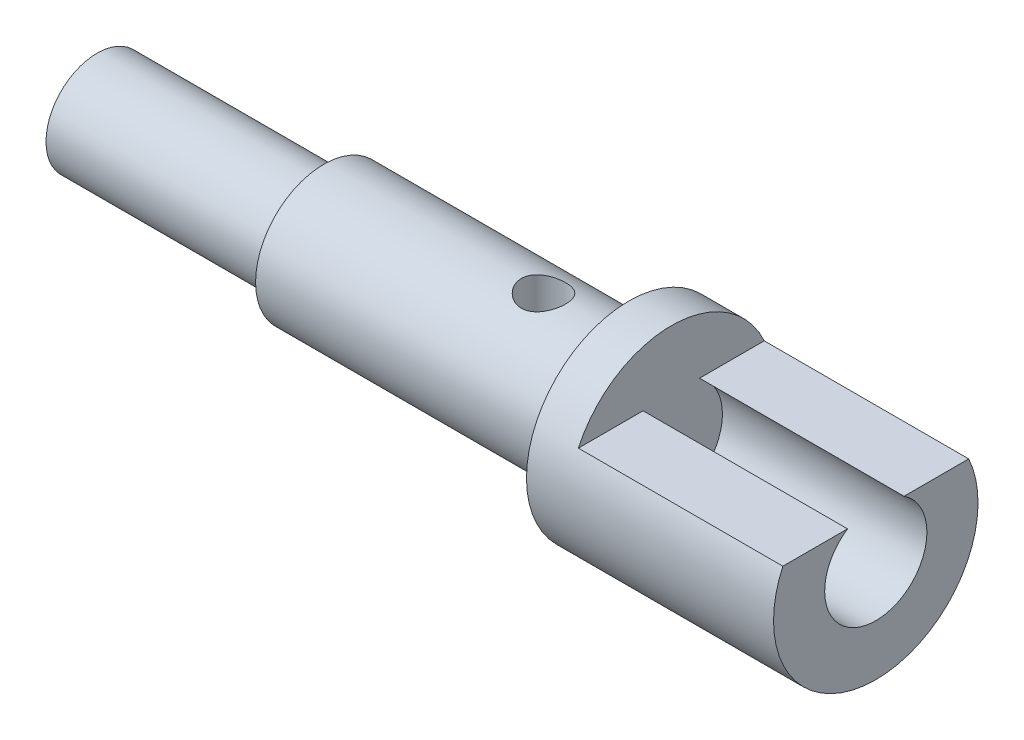
ISO-10303-21;
HEADER;
FILE_DESCRIPTION(('STEP AP214'),'2;1');
FILE_NAME('part.step','',(''),(''),'','','');
FILE_SCHEMA(('AUTOMOTIVE_DESIGN { 1 0 10303 214 1 1 1 1 }'));
ENDSEC;
DATA;
#1=APPLICATION_CONTEXT('core data for automotive mechanical design processes');
#2=APPLICATION_PROTOCOL_DEFINITION('international standard','automotive_design',2000,#1);
#3=PRODUCT_CONTEXT('',#1,'mechanical');
#4=PRODUCT('Part','Part','',(#3));
#5=PRODUCT_RELATED_PRODUCT_CATEGORY('part','',(#4));
#6=PRODUCT_DEFINITION_FORMATION('','',#4);
#7=PRODUCT_DEFINITION_CONTEXT('part definition',#1,'design');
#8=PRODUCT_DEFINITION('design','',#6,#7);
#9=PRODUCT_DEFINITION_SHAPE('','',#8);
#10=(LENGTH_UNIT() NAMED_UNIT(*) SI_UNIT(.MILLI.,.METRE.));
#11=(NAMED_UNIT(*) PLANE_ANGLE_UNIT() SI_UNIT($,.RADIAN.));
#12=(NAMED_UNIT(*) SI_UNIT($,.STERADIAN.) SOLID_ANGLE_UNIT());
#13=UNCERTAINTY_MEASURE_WITH_UNIT(LENGTH_MEASURE(1.E-05),#10,'distance_accuracy_value','');
#14=(GEOMETRIC_REPRESENTATION_CONTEXT(3) GLOBAL_UNCERTAINTY_ASSIGNED_CONTEXT((#13)) GLOBAL_UNIT_ASSIGNED_CONTEXT((#10,
#11,#12)) REPRESENTATION_CONTEXT('',''));
#15=CARTESIAN_POINT('',(0.,0.,0.));
#16=DIRECTION('',(0.,0.,1.));
#17=DIRECTION('',(1.,0.,0.));
#18=AXIS2_PLACEMENT_3D('',#15,#16,#17);
#19=CARTESIAN_POINT('',(31.2,0.,0.));
#20=DIRECTION('',(-1.,0.,0.));
#21=DIRECTION('',(0.,0.,1.));
#22=AXIS2_PLACEMENT_3D('',#19,#20,#21);
#23=CYLINDRICAL_SURFACE('',#22,4.);
#24=CARTESIAN_POINT('',(26.2,-3.78285606387555,1.3));
#25=CARTESIAN_POINT('',(26.1290801876133,-3.78285612771786,1.29999998637502));
#26=CARTESIAN_POINT('',(26.0581595683784,-3.78487224616612,1.29417693564307));
#27=CARTESIAN_POINT('',(25.918412307023,-3.79267955994554,1.27111225354953));
#28=CARTESIAN_POINT('',(25.8495861006694,-3.7984715353425,1.25386826268932));
#29=CARTESIAN_POINT('',(25.7160735528143,-3.81310673893288,1.20862563505493));
#30=CARTESIAN_POINT('',(25.6513796870643,-3.82194422252289,1.18064723492753));
#31=CARTESIAN_POINT('',(25.52758428474,-3.84166647872619,1.11479847755594));
#32=CARTESIAN_POINT('',(25.4684838881169,-3.85255166731782,1.07692610980589));
#33=CARTESIAN_POINT('',(25.3553559191439,-3.87559670629671,0.990856417647431));
#34=CARTESIAN_POINT('',(25.3015667315565,-3.88778716913958,0.942353886785881));
#35=CARTESIAN_POINT('',(25.2027244131502,-3.91180974753888,0.837052737978216));
#36=CARTESIAN_POINT('',(25.1576726085991,-3.92364180846299,0.780252862849214));
#37=CARTESIAN_POINT('',(25.0765143976226,-3.94596712912291,0.658238411185169));
#38=CARTESIAN_POINT('',(25.0406560247438,-3.95642017130275,0.592850847227957));
#39=CARTESIAN_POINT('',(24.9805404152484,-3.97445029673354,0.45657453117507));
#40=CARTESIAN_POINT('',(24.9562802157886,-3.98202811438068,0.385687189424112));
#41=CARTESIAN_POINT('',(24.9208529283771,-3.99323720505228,0.242921590185566));
#42=CARTESIAN_POINT('',(24.9092778474758,-3.99699116344267,0.171154386910905));
#43=CARTESIAN_POINT('',(24.8982539657494,-4.00056416931378,0.0266048150491737));
#44=CARTESIAN_POINT('',(24.8988021900175,-4.00038418213545,-0.0461773001104792));
#45=CARTESIAN_POINT('',(24.9117466571108,-3.99619364718308,-0.187809508580037));
#46=CARTESIAN_POINT('',(24.9237001100819,-3.99232626078031,-0.256704993176162));
#47=CARTESIAN_POINT('',(24.9583858033067,-3.9813737177908,-0.391452898560638));
#48=CARTESIAN_POINT('',(24.98111876401,-3.97428834613103,-0.457305115629002));
#49=CARTESIAN_POINT('',(25.0369871544799,-3.95750964480828,-0.585087039024713));
#50=CARTESIAN_POINT('',(25.0702519683615,-3.94778410475558,-0.646955772497173));
#51=CARTESIAN_POINT('',(25.1461343580486,-3.92674246369522,-0.764366772514483));
#52=CARTESIAN_POINT('',(25.1887544418315,-3.91542593646591,-0.819907336515701));
#53=CARTESIAN_POINT('',(25.2843861309341,-3.89180042429931,-0.925722197538991));
#54=CARTESIAN_POINT('',(25.3377783322912,-3.87946969202396,-0.97564816374936));
#55=CARTESIAN_POINT('',(25.452286836203,-3.8556379454429,-1.06594676141883));
#56=CARTESIAN_POINT('',(25.5134042082243,-3.84413704636561,-1.10631806791115));
#57=CARTESIAN_POINT('',(25.6426829890106,-3.82315182253367,-1.17681175206145));
#58=CARTESIAN_POINT('',(25.710925423276,-3.81369556435766,-1.20679452245038));
#59=CARTESIAN_POINT('',(25.8518738708974,-3.79819677806255,-1.25472837651415));
#60=CARTESIAN_POINT('',(25.9245781111602,-3.7921529034991,-1.27268420625183));
#61=CARTESIAN_POINT('',(26.0690270157782,-3.78446551581416,-1.29536048219797));
#62=CARTESIAN_POINT('',(26.1406778492493,-3.78264347747946,-1.3006183101324));
#63=CARTESIAN_POINT('',(26.2838465206955,-3.78310839816302,-1.29926602497262));
#64=CARTESIAN_POINT('',(26.3553643792448,-3.78539465735251,-1.29265793318104));
#65=CARTESIAN_POINT('',(26.4938463601344,-3.79364128301231,-1.26824322876077));
#66=CARTESIAN_POINT('',(26.560882964942,-3.7994813806764,-1.25080281914733));
#67=CARTESIAN_POINT('',(26.6910673762716,-3.81404732734364,-1.2056541043164));
#68=CARTESIAN_POINT('',(26.7542145131044,-3.82277367166269,-1.17794403659911));
#69=CARTESIAN_POINT('',(26.8769612662532,-3.84245888642472,-1.11208011614265));
#70=CARTESIAN_POINT('',(26.9363938782897,-3.85347774554132,-1.07363343158238));
#71=CARTESIAN_POINT('',(27.048158893736,-3.87638690296162,-0.98772352783187));
#72=CARTESIAN_POINT('',(27.1004892972951,-3.88827744526959,-0.940257778032011));
#73=CARTESIAN_POINT('',(27.1990163736486,-3.91224285586513,-0.835098032106396));
#74=CARTESIAN_POINT('',(27.2448270516538,-3.92430161202931,-0.777037691903762));
#75=CARTESIAN_POINT('',(27.3260762250894,-3.94670982473907,-0.653758926475176));
#76=CARTESIAN_POINT('',(27.3615151381005,-3.95705935009319,-0.588540789576765));
#77=CARTESIAN_POINT('',(27.4206824206189,-3.97482978260151,-0.453157385214432));
#78=CARTESIAN_POINT('',(27.4444910884153,-3.98227069809607,-0.383029975227223));
#79=CARTESIAN_POINT('',(27.4798865698338,-3.9934726882738,-0.239479013843675));
#80=CARTESIAN_POINT('',(27.491477554083,-3.99723501864663,-0.166056596159588));
#81=CARTESIAN_POINT('',(27.501747970419,-4.00056582978003,-0.0215393353329791));
#82=CARTESIAN_POINT('',(27.5009828635471,-4.00031473710671,0.0495123185890754));
#83=CARTESIAN_POINT('',(27.4879220482261,-3.99608624347839,0.190428002988575));
#84=CARTESIAN_POINT('',(27.4756271985669,-3.99210912005583,0.26029212152468));
#85=CARTESIAN_POINT('',(27.4402187126954,-3.98093800748819,0.395848355030433));
#86=CARTESIAN_POINT('',(27.4172641574112,-3.97379138683307,0.461586202747414));
#87=CARTESIAN_POINT('',(27.3613335517974,-3.95701734013223,0.588305667201566));
#88=CARTESIAN_POINT('',(27.3283557221735,-3.9473894736712,0.649286437062812));
#89=CARTESIAN_POINT('',(27.2519542189635,-3.92622151264744,0.767136756616273));
#90=CARTESIAN_POINT('',(27.2081991169553,-3.91462534018168,0.823781249191498));
#91=CARTESIAN_POINT('',(27.1120572379489,-3.89097421850494,0.929106520446989));
#92=CARTESIAN_POINT('',(27.0596677765308,-3.87891912751551,0.977784813028035));
#93=CARTESIAN_POINT('',(26.9454448756089,-3.85518605580607,1.06760515091112));
#94=CARTESIAN_POINT('',(26.8833355709839,-3.84353811451073,1.10840538095549));
#95=CARTESIAN_POINT('',(26.7527836227471,-3.82249023530611,1.17895321389889));
#96=CARTESIAN_POINT('',(26.6843430223426,-3.81308957565012,1.20870436707114));
#97=CARTESIAN_POINT('',(26.5473831663509,-3.79820133944386,1.25467797781187));
#98=CARTESIAN_POINT('',(26.4791280362841,-3.79250852489503,1.27162042160498));
#99=CARTESIAN_POINT('',(26.3405817876102,-3.78483641596639,1.29427974512782));
#100=CARTESIAN_POINT('',(26.2702912901102,-3.78285600059904,1.30000001350422));
#101=CARTESIAN_POINT('',(26.2,-3.78285606387555,1.3));
#102=B_SPLINE_CURVE_WITH_KNOTS('',3,(#24,#25,#26,#27,#28,#29,#30,#31,#32,#33,#34,#35,#36,#37,
#38,#39,#40,#41,#42,#43,#44,#45,#46,#47,#48,#49,#50,#51,#52,#53,#54,#55,#56,#57,#58,#59,#60,#61,
#62,#63,#64,#65,#66,#67,#68,#69,#70,#71,#72,#73,#74,#75,#76,#77,#78,#79,#80,#81,#82,#83,#84,#85,
#86,#87,#88,#89,#90,#91,#92,#93,#94,#95,#96,#97,#98,#99,#100,#101),.UNSPECIFIED.,.T.,.F.,(4,2,2,
2,2,2,2,2,2,2,2,2,2,2,2,2,2,2,2,2,2,2,2,2,2,2,2,2,2,2,2,2,2,2,2,2,2,2,4),(0.,0.212499402014874,
0.425042718847951,0.637187299645767,0.849375022906671,1.06872075418688,1.28809975445794,
1.51288949193992,1.73762177441719,1.95489211897283,2.17210914870698,2.38122222883872,
2.59034928703453,2.80215225758898,3.01401207815805,3.235382443622,3.4567834890635,
3.68105389836766,3.90523575401773,4.11974977776661,4.33422726354507,4.54182147149083,
4.74945132369134,4.96341563382456,5.17744006790926,5.4011745661775,5.62490005536644,
5.84705824934249,6.0691405828361,6.28126825800324,6.49338013415177,6.70242353387924,
6.91150406390515,7.12806277059302,7.34468893277309,7.56925885258851,7.79375655136618,
8.00443631772979,8.21505245745966),.UNSPECIFIED.);
#103=CARTESIAN_POINT('',(26.2,-3.78285606387555,1.3));
#104=VERTEX_POINT('',#103);
#105=EDGE_CURVE('E39',#104,#104,#102,.T.);
#106=ORIENTED_EDGE('',*,*,#105,.F.);
#107=EDGE_LOOP('',(#106));
#108=FACE_BOUND('',#107,.T.);
#109=CARTESIAN_POINT('',(26.2,3.78285606387555,1.3));
#110=CARTESIAN_POINT('',(26.2709198123868,3.78285612771786,1.29999998637502));
#111=CARTESIAN_POINT('',(26.3418404316216,3.78487224616612,1.29417693564307));
#112=CARTESIAN_POINT('',(26.481587692977,3.79267955994554,1.27111225354953));
#113=CARTESIAN_POINT('',(26.5504138993306,3.7984715353425,1.25386826268932));
#114=CARTESIAN_POINT('',(26.6839264471858,3.81310673893288,1.20862563505493));
#115=CARTESIAN_POINT('',(26.7486203129357,3.82194422252289,1.18064723492753));
#116=CARTESIAN_POINT('',(26.87241571526,3.84166647872619,1.11479847755594));
#117=CARTESIAN_POINT('',(26.9315161118831,3.85255166731782,1.0769261098059));
#118=CARTESIAN_POINT('',(27.0446440808561,3.87559670629671,0.990856417647434));
#119=CARTESIAN_POINT('',(27.0984332684435,3.88778716913958,0.942353886785882));
#120=CARTESIAN_POINT('',(27.1972755868499,3.91180974753888,0.837052737978217));
#121=CARTESIAN_POINT('',(27.2423273914009,3.92364180846299,0.780252862849215));
#122=CARTESIAN_POINT('',(27.3234856023774,3.94596712912291,0.65823841118517));
#123=CARTESIAN_POINT('',(27.3593439752562,3.95642017130275,0.592850847227957));
#124=CARTESIAN_POINT('',(27.4194595847516,3.97445029673354,0.45657453117507));
#125=CARTESIAN_POINT('',(27.4437197842114,3.98202811438068,0.385687189424112));
#126=CARTESIAN_POINT('',(27.4791470716229,3.99323720505228,0.242921590185566));
#127=CARTESIAN_POINT('',(27.4907221525242,3.99699116344267,0.171154386910905));
#128=CARTESIAN_POINT('',(27.5017460342507,4.00056416931378,0.0266048150491737));
#129=CARTESIAN_POINT('',(27.5011978099825,4.00038418213545,-0.0461773001104791));
#130=CARTESIAN_POINT('',(27.4882533428892,3.99619364718308,-0.187809508580038));
#131=CARTESIAN_POINT('',(27.4762998899181,3.99232626078031,-0.256704993176163));
#132=CARTESIAN_POINT('',(27.4416141966933,3.9813737177908,-0.391452898560639));
#133=CARTESIAN_POINT('',(27.41888123599,3.97428834613103,-0.457305115629003));
#134=CARTESIAN_POINT('',(27.3630128455201,3.95750964480828,-0.585087039024714));
#135=CARTESIAN_POINT('',(27.3297480316385,3.94778410475558,-0.646955772497174));
#136=CARTESIAN_POINT('',(27.2538656419514,3.92674246369522,-0.764366772514484));
#137=CARTESIAN_POINT('',(27.2112455581685,3.91542593646591,-0.819907336515702));
#138=CARTESIAN_POINT('',(27.1156138690659,3.89180042429931,-0.925722197538991));
#139=CARTESIAN_POINT('',(27.0622216677088,3.87946969202396,-0.97564816374936));
#140=CARTESIAN_POINT('',(26.9477131637971,3.8556379454429,-1.06594676141883));
#141=CARTESIAN_POINT('',(26.8865957917757,3.84413704636561,-1.10631806791115));
#142=CARTESIAN_POINT('',(26.7573170109894,3.82315182253367,-1.17681175206145));
#143=CARTESIAN_POINT('',(26.689074576724,3.81369556435766,-1.20679452245038));
#144=CARTESIAN_POINT('',(26.5481261291026,3.79819677806255,-1.25472837651415));
#145=CARTESIAN_POINT('',(26.4754218888398,3.7921529034991,-1.27268420625183));
#146=CARTESIAN_POINT('',(26.3309729842218,3.78446551581416,-1.29536048219797));
#147=CARTESIAN_POINT('',(26.2593221507507,3.78264347747946,-1.3006183101324));
#148=CARTESIAN_POINT('',(26.1161534793045,3.78310839816302,-1.29926602497262));
#149=CARTESIAN_POINT('',(26.0446356207553,3.78539465735251,-1.29265793318104));
#150=CARTESIAN_POINT('',(25.9061536398656,3.79364128301231,-1.26824322876077));
#151=CARTESIAN_POINT('',(25.839117035058,3.7994813806764,-1.25080281914733));
#152=CARTESIAN_POINT('',(25.7089326237284,3.81404732734364,-1.2056541043164));
#153=CARTESIAN_POINT('',(25.6457854868956,3.82277367166269,-1.17794403659911));
#154=CARTESIAN_POINT('',(25.5230387337468,3.84245888642472,-1.11208011614265));
#155=CARTESIAN_POINT('',(25.4636061217104,3.85347774554132,-1.07363343158238));
#156=CARTESIAN_POINT('',(25.351841106264,3.87638690296162,-0.987723527831869));
#157=CARTESIAN_POINT('',(25.2995107027049,3.88827744526959,-0.94025777803201));
#158=CARTESIAN_POINT('',(25.2009836263514,3.91224285586513,-0.835098032106395));
#159=CARTESIAN_POINT('',(25.1551729483463,3.92430161202931,-0.777037691903761));
#160=CARTESIAN_POINT('',(25.0739237749106,3.94670982473907,-0.653758926475175));
#161=CARTESIAN_POINT('',(25.0384848618995,3.95705935009319,-0.588540789576765));
#162=CARTESIAN_POINT('',(24.9793175793811,3.97482978260151,-0.453157385214432));
#163=CARTESIAN_POINT('',(24.9555089115847,3.98227069809607,-0.383029975227224));
#164=CARTESIAN_POINT('',(24.9201134301662,3.9934726882738,-0.239479013843676));
#165=CARTESIAN_POINT('',(24.908522445917,3.99723501864663,-0.166056596159589));
#166=CARTESIAN_POINT('',(24.898252029581,4.00056582978003,-0.0215393353329793));
#167=CARTESIAN_POINT('',(24.8990171364529,4.00031473710671,0.0495123185890752));
#168=CARTESIAN_POINT('',(24.9120779517739,3.99608624347839,0.190428002988575));
#169=CARTESIAN_POINT('',(24.9243728014332,3.99210912005583,0.26029212152468));
#170=CARTESIAN_POINT('',(24.9597812873046,3.98093800748819,0.395848355030434));
#171=CARTESIAN_POINT('',(24.9827358425888,3.97379138683307,0.461586202747416));
#172=CARTESIAN_POINT('',(25.0386664482026,3.95701734013223,0.588305667201568));
#173=CARTESIAN_POINT('',(25.0716442778265,3.9473894736712,0.649286437062813));
#174=CARTESIAN_POINT('',(25.1480457810365,3.92622151264744,0.767136756616274));
#175=CARTESIAN_POINT('',(25.1918008830447,3.91462534018168,0.8237812491915));
#176=CARTESIAN_POINT('',(25.2879427620511,3.89097421850494,0.92910652044699));
#177=CARTESIAN_POINT('',(25.3403322234692,3.87891912751551,0.977784813028037));
#178=CARTESIAN_POINT('',(25.4545551243911,3.85518605580607,1.06760515091112));
#179=CARTESIAN_POINT('',(25.5166644290161,3.84353811451073,1.10840538095549));
#180=CARTESIAN_POINT('',(25.6472163772529,3.82249023530611,1.17895321389889));
#181=CARTESIAN_POINT('',(25.7156569776574,3.81308957565012,1.20870436707114));
#182=CARTESIAN_POINT('',(25.8526168336491,3.79820133944386,1.25467797781187));
#183=CARTESIAN_POINT('',(25.9208719637159,3.79250852489503,1.27162042160498));
#184=CARTESIAN_POINT('',(26.0594182123898,3.78483641596639,1.29427974512782));
#185=CARTESIAN_POINT('',(26.1297087098898,3.78285600059904,1.30000001350422));
#186=CARTESIAN_POINT('',(26.2,3.78285606387555,1.3));
#187=B_SPLINE_CURVE_WITH_KNOTS('',3,(#109,#110,#111,#112,#113,#114,#115,#116,#117,#118,#119,
#120,#121,#122,#123,#124,#125,#126,#127,#128,#129,#130,#131,#132,#133,#134,#135,#136,#137,#138,
#139,#140,#141,#142,#143,#144,#145,#146,#147,#148,#149,#150,#151,#152,#153,#154,#155,#156,#157,
#158,#159,#160,#161,#162,#163,#164,#165,#166,#167,#168,#169,#170,#171,#172,#173,#174,#175,#176,
#177,#178,#179,#180,#181,#182,#183,#184,#185,#186),.UNSPECIFIED.,.T.,.F.,(4,2,2,2,2,2,2,2,2,2,2,
2,2,2,2,2,2,2,2,2,2,2,2,2,2,2,2,2,2,2,2,2,2,2,2,2,2,2,4),(0.,0.212499402014874,
0.425042718847951,0.637187299645767,0.849375022906667,1.06872075418687,1.28809975445794,
1.51288949193992,1.73762177441719,1.95489211897283,2.17210914870698,2.38122222883873,
2.59034928703453,2.80215225758898,3.01401207815805,3.235382443622,3.4567834890635,
3.68105389836766,3.90523575401773,4.11974977776661,4.33422726354507,4.54182147149083,
4.74945132369134,4.96341563382457,5.17744006790926,5.4011745661775,5.62490005536644,
5.84705824934249,6.0691405828361,6.28126825800324,6.49338013415177,6.70242353387924,
6.91150406390515,7.12806277059303,7.34468893277309,7.56925885258851,7.79375655136618,
8.00443631772978,8.21505245745966),.UNSPECIFIED.);
#188=CARTESIAN_POINT('',(26.2,3.78285606387555,1.3));
#189=VERTEX_POINT('',#188);
#190=EDGE_CURVE('E121',#189,#189,#187,.T.);
#191=ORIENTED_EDGE('',*,*,#190,.F.);
#192=EDGE_LOOP('',(#191));
#193=FACE_BOUND('',#192,.T.);
#194=CARTESIAN_POINT('',(31.2,0.,0.));
#195=DIRECTION('',(-1.,0.,0.));
#196=DIRECTION('',(0.,0.,1.));
#197=AXIS2_PLACEMENT_3D('',#194,#195,#196);
#198=CIRCLE('',#197,4.);
#199=CARTESIAN_POINT('',(31.2,0.,4.));
#200=VERTEX_POINT('',#199);
#201=EDGE_CURVE('E117',#200,#200,#198,.T.);
#202=ORIENTED_EDGE('',*,*,#201,.T.);
#203=EDGE_LOOP('',(#202));
#204=FACE_BOUND('',#203,.T.);
#205=CARTESIAN_POINT('',(13.3,0.,0.));
#206=DIRECTION('',(-1.,0.,0.));
#207=DIRECTION('',(0.,0.,1.));
#208=AXIS2_PLACEMENT_3D('',#205,#206,#207);
#209=CIRCLE('',#208,4.);
#210=CARTESIAN_POINT('',(13.3,0.,4.));
#211=VERTEX_POINT('',#210);
#212=EDGE_CURVE('E118',#211,#211,#209,.F.);
#213=ORIENTED_EDGE('',*,*,#212,.T.);
#214=EDGE_LOOP('',(#213));
#215=FACE_BOUND('',#214,.T.);
#216=ADVANCED_FACE('F35',(#108,#193,#204,#215),#23,.T.);
#217=CARTESIAN_POINT('',(45.7,0.,0.));
#218=DIRECTION('',(-1.,0.,0.));
#219=DIRECTION('',(0.,0.,1.));
#220=AXIS2_PLACEMENT_3D('',#217,#218,#219);
#221=CYLINDRICAL_SURFACE('',#220,6.);
#222=CARTESIAN_POINT('',(45.7,0.,0.));
#223=DIRECTION('',(1.,0.,0.));
#224=DIRECTION('',(0.,0.,-1.));
#225=AXIS2_PLACEMENT_3D('',#222,#223,#224);
#226=CIRCLE('',#225,6.);
#227=CARTESIAN_POINT('',(45.7,2.5,5.45435605731786));
#228=VERTEX_POINT('',#227);
#229=CARTESIAN_POINT('',(45.7,2.5,-5.45435605731786));
#230=VERTEX_POINT('',#229);
#231=EDGE_CURVE('E12',#228,#230,#226,.T.);
#232=ORIENTED_EDGE('',*,*,#231,.F.);
#233=DIRECTION('',(1.,0.,0.));
#234=VECTOR('',#233,1.);
#235=CARTESIAN_POINT('',(33.7,2.5,5.45435605731786));
#236=LINE('',#235,#234);
#237=CARTESIAN_POINT('',(33.7,2.5,5.45435605731786));
#238=VERTEX_POINT('',#237);
#239=EDGE_CURVE('E94',#238,#228,#236,.T.);
#240=ORIENTED_EDGE('',*,*,#239,.F.);
#241=CARTESIAN_POINT('',(33.7,0.,0.));
#242=DIRECTION('',(1.,0.,0.));
#243=DIRECTION('',(0.,0.,-1.));
#244=AXIS2_PLACEMENT_3D('',#241,#242,#243);
#245=CIRCLE('',#244,6.);
#246=CARTESIAN_POINT('',(33.7,2.5,-5.45435605731786));
#247=VERTEX_POINT('',#246);
#248=EDGE_CURVE('E99',#247,#238,#245,.T.);
#249=ORIENTED_EDGE('',*,*,#248,.F.);
#250=DIRECTION('',(1.,0.,0.));
#251=VECTOR('',#250,1.);
#252=CARTESIAN_POINT('',(33.7,2.5,-5.45435605731786));
#253=LINE('',#252,#251);
#254=EDGE_CURVE('E84',#247,#230,#253,.T.);
#255=ORIENTED_EDGE('',*,*,#254,.T.);
#256=EDGE_LOOP('',(#232,#240,#249,#255));
#257=FACE_BOUND('',#256,.T.);
#258=CARTESIAN_POINT('',(31.2,0.,0.));
#259=DIRECTION('',(-1.,0.,0.));
#260=DIRECTION('',(0.,0.,1.));
#261=AXIS2_PLACEMENT_3D('',#258,#259,#260);
#262=CIRCLE('',#261,6.);
#263=CARTESIAN_POINT('',(31.2,0.,6.));
#264=VERTEX_POINT('',#263);
#265=EDGE_CURVE('E109',#264,#264,#262,.T.);
#266=ORIENTED_EDGE('',*,*,#265,.F.);
#267=EDGE_LOOP('',(#266));
#268=FACE_BOUND('',#267,.T.);
#269=ADVANCED_FACE('F37',(#257,#268),#221,.T.);
#270=CARTESIAN_POINT('',(45.7,0.,0.));
#271=DIRECTION('',(1.,0.,0.));
#272=DIRECTION('',(0.,0.,-1.));
#273=AXIS2_PLACEMENT_3D('',#270,#271,#272);
#274=PLANE('',#273);
#275=DIRECTION('',(0.,0.,-1.));
#276=VECTOR('',#275,1.);
#277=CARTESIAN_POINT('',(45.7,2.5,0.));
#278=LINE('',#277,#276);
#279=CARTESIAN_POINT('',(45.7,2.5,1.6583123951777));
#280=VERTEX_POINT('',#279);
#281=EDGE_CURVE('E111',#228,#280,#278,.T.);
#282=ORIENTED_EDGE('',*,*,#281,.F.);
#283=ORIENTED_EDGE('',*,*,#231,.T.);
#284=CARTESIAN_POINT('',(45.7,2.5,-1.6583123951777));
#285=VERTEX_POINT('',#284);
#286=EDGE_CURVE('E90',#285,#230,#278,.T.);
#287=ORIENTED_EDGE('',*,*,#286,.F.);
#288=CARTESIAN_POINT('',(45.7,0.,0.));
#289=DIRECTION('',(1.,0.,0.));
#290=DIRECTION('',(0.,0.,-1.));
#291=AXIS2_PLACEMENT_3D('',#288,#289,#290);
#292=CIRCLE('',#291,3.);
#293=EDGE_CURVE('E57',#280,#285,#292,.T.);
#294=ORIENTED_EDGE('',*,*,#293,.F.);
#295=EDGE_LOOP('',(#282,#283,#287,#294));
#296=FACE_BOUND('',#295,.T.);
#297=ADVANCED_FACE('F154',(#296),#274,.T.);
#298=CARTESIAN_POINT('',(33.7,0.,0.));
#299=DIRECTION('',(1.,0.,0.));
#300=DIRECTION('',(0.,0.,-1.));
#301=AXIS2_PLACEMENT_3D('',#298,#299,#300);
#302=CYLINDRICAL_SURFACE('',#301,3.);
#303=ORIENTED_EDGE('',*,*,#293,.T.);
#304=DIRECTION('',(1.,0.,0.));
#305=VECTOR('',#304,1.);
#306=CARTESIAN_POINT('',(33.7,2.5,-1.6583123951777));
#307=LINE('',#306,#305);
#308=CARTESIAN_POINT('',(33.7,2.5,-1.6583123951777));
#309=VERTEX_POINT('',#308);
#310=EDGE_CURVE('E79',#309,#285,#307,.T.);
#311=ORIENTED_EDGE('',*,*,#310,.F.);
#312=CARTESIAN_POINT('',(33.7,0.,0.));
#313=DIRECTION('',(1.,0.,0.));
#314=DIRECTION('',(0.,0.,-1.));
#315=AXIS2_PLACEMENT_3D('',#312,#313,#314);
#316=CIRCLE('',#315,3.);
#317=CARTESIAN_POINT('',(33.7,2.5,1.6583123951777));
#318=VERTEX_POINT('',#317);
#319=EDGE_CURVE('E100',#318,#309,#316,.T.);
#320=ORIENTED_EDGE('',*,*,#319,.F.);
#321=DIRECTION('',(1.,0.,0.));
#322=VECTOR('',#321,1.);
#323=CARTESIAN_POINT('',(33.7,2.5,1.6583123951777));
#324=LINE('',#323,#322);
#325=EDGE_CURVE('E49',#318,#280,#324,.T.);
#326=ORIENTED_EDGE('',*,*,#325,.T.);
#327=EDGE_LOOP('',(#303,#311,#320,#326));
#328=FACE_BOUND('',#327,.T.);
#329=ADVANCED_FACE('F171',(#328),#302,.F.);
#330=CARTESIAN_POINT('',(33.7,2.5,0.));
#331=DIRECTION('',(0.,-1.,0.));
#332=DIRECTION('',(0.,0.,-1.));
#333=AXIS2_PLACEMENT_3D('',#330,#331,#332);
#334=PLANE('',#333);
#335=ORIENTED_EDGE('',*,*,#281,.T.);
#336=ORIENTED_EDGE('',*,*,#325,.F.);
#337=DIRECTION('',(0.,0.,-1.));
#338=VECTOR('',#337,1.);
#339=CARTESIAN_POINT('',(33.7,2.5,0.));
#340=LINE('',#339,#338);
#341=EDGE_CURVE('E102',#238,#318,#340,.T.);
#342=ORIENTED_EDGE('',*,*,#341,.F.);
#343=ORIENTED_EDGE('',*,*,#239,.T.);
#344=EDGE_LOOP('',(#335,#336,#342,#343));
#345=FACE_BOUND('',#344,.T.);
#346=ADVANCED_FACE('F168',(#345),#334,.F.);
#347=ORIENTED_EDGE('',*,*,#286,.T.);
#348=ORIENTED_EDGE('',*,*,#254,.F.);
#349=EDGE_CURVE('E87',#309,#247,#340,.T.);
#350=ORIENTED_EDGE('',*,*,#349,.F.);
#351=ORIENTED_EDGE('',*,*,#310,.T.);
#352=EDGE_LOOP('',(#347,#348,#350,#351));
#353=FACE_BOUND('',#352,.T.);
#354=ADVANCED_FACE('F86',(#353),#334,.F.);
#355=CARTESIAN_POINT('',(33.7,0.,0.));
#356=DIRECTION('',(1.,0.,0.));
#357=DIRECTION('',(0.,0.,-1.));
#358=AXIS2_PLACEMENT_3D('',#355,#356,#357);
#359=PLANE('',#358);
#360=ORIENTED_EDGE('',*,*,#319,.T.);
#361=ORIENTED_EDGE('',*,*,#349,.T.);
#362=ORIENTED_EDGE('',*,*,#248,.T.);
#363=ORIENTED_EDGE('',*,*,#341,.T.);
#364=EDGE_LOOP('',(#360,#361,#362,#363));
#365=FACE_BOUND('',#364,.T.);
#366=ADVANCED_FACE('F97',(#365),#359,.T.);
#367=CARTESIAN_POINT('',(31.2,0.,0.));
#368=DIRECTION('',(-1.,0.,0.));
#369=DIRECTION('',(0.,0.,1.));
#370=AXIS2_PLACEMENT_3D('',#367,#368,#369);
#371=PLANE('',#370);
#372=ORIENTED_EDGE('',*,*,#201,.F.);
#373=EDGE_LOOP('',(#372));
#374=FACE_BOUND('',#373,.T.);
#375=ORIENTED_EDGE('',*,*,#265,.T.);
#376=EDGE_LOOP('',(#375));
#377=FACE_BOUND('',#376,.T.);
#378=ADVANCED_FACE('F141',(#374,#377),#371,.T.);
#379=CARTESIAN_POINT('',(13.3,0.,0.));
#380=DIRECTION('',(-1.,0.,0.));
#381=DIRECTION('',(0.,0.,1.));
#382=AXIS2_PLACEMENT_3D('',#379,#380,#381);
#383=PLANE('',#382);
#384=ORIENTED_EDGE('',*,*,#212,.F.);
#385=EDGE_LOOP('',(#384));
#386=FACE_BOUND('',#385,.T.);
#387=CARTESIAN_POINT('',(13.3,0.,0.));
#388=DIRECTION('',(-1.,0.,0.));
#389=DIRECTION('',(0.,0.,1.));
#390=AXIS2_PLACEMENT_3D('',#387,#388,#389);
#391=CIRCLE('',#390,3.);
#392=CARTESIAN_POINT('',(13.3,0.,3.));
#393=VERTEX_POINT('',#392);
#394=EDGE_CURVE('E120',#393,#393,#391,.T.);
#395=ORIENTED_EDGE('',*,*,#394,.F.);
#396=EDGE_LOOP('',(#395));
#397=FACE_BOUND('',#396,.T.);
#398=ADVANCED_FACE('F138',(#386,#397),#383,.T.);
#399=CARTESIAN_POINT('',(13.3,0.,0.));
#400=DIRECTION('',(-1.,0.,0.));
#401=DIRECTION('',(0.,0.,1.));
#402=AXIS2_PLACEMENT_3D('',#399,#400,#401);
#403=CYLINDRICAL_SURFACE('',#402,3.);
#404=ORIENTED_EDGE('',*,*,#394,.T.);
#405=EDGE_LOOP('',(#404));
#406=FACE_BOUND('',#405,.T.);
#407=CARTESIAN_POINT('',(0.,0.,0.));
#408=DIRECTION('',(-1.,0.,0.));
#409=DIRECTION('',(0.,0.,1.));
#410=AXIS2_PLACEMENT_3D('',#407,#408,#409);
#411=CIRCLE('',#410,3.);
#412=CARTESIAN_POINT('',(0.,0.,3.));
#413=VERTEX_POINT('',#412);
#414=EDGE_CURVE('E165',#413,#413,#411,.T.);
#415=ORIENTED_EDGE('',*,*,#414,.F.);
#416=EDGE_LOOP('',(#415));
#417=FACE_BOUND('',#416,.T.);
#418=ADVANCED_FACE('F135',(#406,#417),#403,.T.);
#419=CARTESIAN_POINT('',(0.,0.,0.));
#420=DIRECTION('',(1.,0.,0.));
#421=DIRECTION('',(0.,0.,-1.));
#422=AXIS2_PLACEMENT_3D('',#419,#420,#421);
#423=PLANE('',#422);
#424=ORIENTED_EDGE('',*,*,#414,.T.);
#425=EDGE_LOOP('',(#424));
#426=FACE_BOUND('',#425,.T.);
#427=ADVANCED_FACE('F133',(#426),#423,.F.);
#428=CARTESIAN_POINT('',(26.2,-6.,0.));
#429=DIRECTION('',(0.,1.,0.));
#430=DIRECTION('',(0.,0.,1.));
#431=AXIS2_PLACEMENT_3D('',#428,#429,#430);
#432=CYLINDRICAL_SURFACE('',#431,1.3);
#433=ORIENTED_EDGE('',*,*,#105,.T.);
#434=EDGE_LOOP('',(#433));
#435=FACE_BOUND('',#434,.T.);
#436=ORIENTED_EDGE('',*,*,#190,.T.);
#437=EDGE_LOOP('',(#436));
#438=FACE_BOUND('',#437,.T.);
#439=ADVANCED_FACE('F129',(#435,#438),#432,.F.);
#440=CLOSED_SHELL('',(#216,#269,#297,#329,#346,#354,#366,#378,#398,#418,#427,#439));
#441=MANIFOLD_SOLID_BREP('B2',#440);
#442=ADVANCED_BREP_SHAPE_REPRESENTATION('',(#18,#441),#14);
#443=SHAPE_DEFINITION_REPRESENTATION(#9,#442);
ENDSEC;
END-ISO-10303-21;
